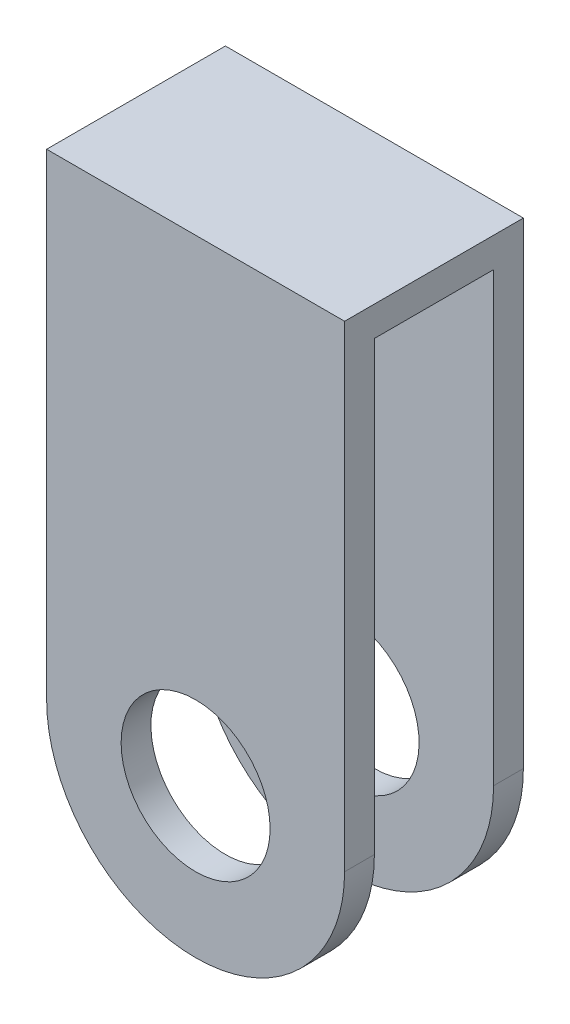
ISO-10303-21;
HEADER;
FILE_DESCRIPTION(('STEP AP214'),'2;1');
FILE_NAME('part.step','',(''),(''),'','','');
FILE_SCHEMA(('AUTOMOTIVE_DESIGN { 1 0 10303 214 1 1 1 1 }'));
ENDSEC;
DATA;
#1=APPLICATION_CONTEXT('core data for automotive mechanical design processes');
#2=APPLICATION_PROTOCOL_DEFINITION('international standard','automotive_design',2000,#1);
#3=PRODUCT_CONTEXT('',#1,'mechanical');
#4=PRODUCT('Part','Part','',(#3));
#5=PRODUCT_RELATED_PRODUCT_CATEGORY('part','',(#4));
#6=PRODUCT_DEFINITION_FORMATION('','',#4);
#7=PRODUCT_DEFINITION_CONTEXT('part definition',#1,'design');
#8=PRODUCT_DEFINITION('design','',#6,#7);
#9=PRODUCT_DEFINITION_SHAPE('','',#8);
#10=(LENGTH_UNIT() NAMED_UNIT(*) SI_UNIT(.MILLI.,.METRE.));
#11=(NAMED_UNIT(*) PLANE_ANGLE_UNIT() SI_UNIT($,.RADIAN.));
#12=(NAMED_UNIT(*) SI_UNIT($,.STERADIAN.) SOLID_ANGLE_UNIT());
#13=UNCERTAINTY_MEASURE_WITH_UNIT(LENGTH_MEASURE(1.E-05),#10,'distance_accuracy_value','');
#14=(GEOMETRIC_REPRESENTATION_CONTEXT(3) GLOBAL_UNCERTAINTY_ASSIGNED_CONTEXT((#13)) GLOBAL_UNIT_ASSIGNED_CONTEXT((#10,
#11,#12)) REPRESENTATION_CONTEXT('',''));
#15=CARTESIAN_POINT('',(0.,0.,0.));
#16=DIRECTION('',(0.,0.,1.));
#17=DIRECTION('',(1.,0.,0.));
#18=AXIS2_PLACEMENT_3D('',#15,#16,#17);
#19=CARTESIAN_POINT('',(7.91136290436442,12.2334894274483,12.));
#20=DIRECTION('',(0.,0.,-1.));
#21=DIRECTION('',(-1.,0.,0.));
#22=AXIS2_PLACEMENT_3D('',#19,#20,#21);
#23=CYLINDRICAL_SURFACE('',#22,10.);
#24=CARTESIAN_POINT('',(7.91136290436442,12.2334894274483,10.));
#25=DIRECTION('',(0.,0.,-1.));
#26=DIRECTION('',(0.,1.,0.));
#27=AXIS2_PLACEMENT_3D('',#24,#25,#26);
#28=CIRCLE('',#27,10.);
#29=CARTESIAN_POINT('',(17.9113629043644,12.2334894274483,10.));
#30=VERTEX_POINT('',#29);
#31=CARTESIAN_POINT('',(-2.08863709563558,12.2334894274483,10.));
#32=VERTEX_POINT('',#31);
#33=EDGE_CURVE('E123',#30,#32,#28,.T.);
#34=ORIENTED_EDGE('',*,*,#33,.F.);
#35=DIRECTION('',(0.,0.,-1.));
#36=VECTOR('',#35,1.);
#37=CARTESIAN_POINT('',(17.9113629043644,12.2334894274483,12.));
#38=LINE('',#37,#36);
#39=CARTESIAN_POINT('',(17.9113629043644,12.2334894274483,12.));
#40=VERTEX_POINT('',#39);
#41=EDGE_CURVE('E11',#40,#30,#38,.T.);
#42=ORIENTED_EDGE('',*,*,#41,.F.);
#43=CARTESIAN_POINT('',(7.91136290436442,12.2334894274483,12.));
#44=DIRECTION('',(0.,0.,1.));
#45=DIRECTION('',(1.,0.,0.));
#46=AXIS2_PLACEMENT_3D('',#43,#44,#45);
#47=CIRCLE('',#46,10.);
#48=CARTESIAN_POINT('',(-2.08863709563558,12.2334894274483,12.));
#49=VERTEX_POINT('',#48);
#50=EDGE_CURVE('E149',#49,#40,#47,.T.);
#51=ORIENTED_EDGE('',*,*,#50,.F.);
#52=DIRECTION('',(0.,0.,-1.));
#53=VECTOR('',#52,1.);
#54=CARTESIAN_POINT('',(-2.08863709563558,12.2334894274483,12.));
#55=LINE('',#54,#53);
#56=EDGE_CURVE('E162',#49,#32,#55,.T.);
#57=ORIENTED_EDGE('',*,*,#56,.T.);
#58=EDGE_LOOP('',(#34,#42,#51,#57));
#59=FACE_BOUND('',#58,.T.);
#60=ADVANCED_FACE('F33',(#59),#23,.T.);
#61=CARTESIAN_POINT('',(17.9113629043644,44.2334894274483,12.));
#62=DIRECTION('',(-1.,0.,0.));
#63=DIRECTION('',(0.,-1.,0.));
#64=AXIS2_PLACEMENT_3D('',#61,#62,#63);
#65=PLANE('',#64);
#66=DIRECTION('',(0.,1.,0.));
#67=VECTOR('',#66,1.);
#68=CARTESIAN_POINT('',(17.9113629043644,42.2334894274483,10.));
#69=LINE('',#68,#67);
#70=CARTESIAN_POINT('',(17.9113629043644,42.2334894274483,10.));
#71=VERTEX_POINT('',#70);
#72=EDGE_CURVE('E116',#30,#71,#69,.T.);
#73=ORIENTED_EDGE('',*,*,#72,.T.);
#74=DIRECTION('',(0.,0.,-1.));
#75=VECTOR('',#74,1.);
#76=CARTESIAN_POINT('',(17.9113629043644,42.2334894274483,2.));
#77=LINE('',#76,#75);
#78=CARTESIAN_POINT('',(17.9113629043644,42.2334894274483,2.));
#79=VERTEX_POINT('',#78);
#80=EDGE_CURVE('E113',#71,#79,#77,.T.);
#81=ORIENTED_EDGE('',*,*,#80,.T.);
#82=DIRECTION('',(0.,1.,0.));
#83=VECTOR('',#82,1.);
#84=CARTESIAN_POINT('',(17.9113629043644,42.2334894274483,2.));
#85=LINE('',#84,#83);
#86=CARTESIAN_POINT('',(17.9113629043644,12.2334894274483,2.00000000000001));
#87=VERTEX_POINT('',#86);
#88=EDGE_CURVE('E136',#87,#79,#85,.T.);
#89=ORIENTED_EDGE('',*,*,#88,.F.);
#90=CARTESIAN_POINT('',(17.9113629043644,12.2334894274483,0.));
#91=VERTEX_POINT('',#90);
#92=EDGE_CURVE('E42',#87,#91,#38,.T.);
#93=ORIENTED_EDGE('',*,*,#92,.T.);
#94=DIRECTION('',(0.,1.,0.));
#95=VECTOR('',#94,1.);
#96=CARTESIAN_POINT('',(17.9113629043644,44.2334894274483,0.));
#97=LINE('',#96,#95);
#98=CARTESIAN_POINT('',(17.9113629043644,44.2334894274483,0.));
#99=VERTEX_POINT('',#98);
#100=EDGE_CURVE('E157',#91,#99,#97,.T.);
#101=ORIENTED_EDGE('',*,*,#100,.T.);
#102=DIRECTION('',(0.,0.,-1.));
#103=VECTOR('',#102,1.);
#104=CARTESIAN_POINT('',(17.9113629043644,44.2334894274483,12.));
#105=LINE('',#104,#103);
#106=CARTESIAN_POINT('',(17.9113629043644,44.2334894274483,12.));
#107=VERTEX_POINT('',#106);
#108=EDGE_CURVE('E167',#107,#99,#105,.T.);
#109=ORIENTED_EDGE('',*,*,#108,.F.);
#110=DIRECTION('',(0.,1.,0.));
#111=VECTOR('',#110,1.);
#112=CARTESIAN_POINT('',(17.9113629043644,44.2334894274483,12.));
#113=LINE('',#112,#111);
#114=EDGE_CURVE('E88',#40,#107,#113,.T.);
#115=ORIENTED_EDGE('',*,*,#114,.F.);
#116=ORIENTED_EDGE('',*,*,#41,.T.);
#117=EDGE_LOOP('',(#73,#81,#89,#93,#101,#109,#115,#116));
#118=FACE_BOUND('',#117,.T.);
#119=ADVANCED_FACE('F196',(#118),#65,.F.);
#120=CARTESIAN_POINT('',(-2.08863709563558,12.2334894274483,12.));
#121=DIRECTION('',(1.,0.,0.));
#122=DIRECTION('',(0.,0.,-1.));
#123=AXIS2_PLACEMENT_3D('',#120,#121,#122);
#124=PLANE('',#123);
#125=DIRECTION('',(0.,-1.,0.));
#126=VECTOR('',#125,1.);
#127=CARTESIAN_POINT('',(-2.08863709563558,42.2334894274483,10.));
#128=LINE('',#127,#126);
#129=CARTESIAN_POINT('',(-2.08863709563558,42.2334894274483,10.));
#130=VERTEX_POINT('',#129);
#131=EDGE_CURVE('E120',#130,#32,#128,.T.);
#132=ORIENTED_EDGE('',*,*,#131,.T.);
#133=ORIENTED_EDGE('',*,*,#56,.F.);
#134=DIRECTION('',(0.,-1.,0.));
#135=VECTOR('',#134,1.);
#136=CARTESIAN_POINT('',(-2.08863709563558,12.2334894274483,12.));
#137=LINE('',#136,#135);
#138=CARTESIAN_POINT('',(-2.08863709563558,44.2334894274483,12.));
#139=VERTEX_POINT('',#138);
#140=EDGE_CURVE('E59',#139,#49,#137,.T.);
#141=ORIENTED_EDGE('',*,*,#140,.F.);
#142=DIRECTION('',(0.,0.,-1.));
#143=VECTOR('',#142,1.);
#144=CARTESIAN_POINT('',(-2.08863709563558,44.2334894274483,12.));
#145=LINE('',#144,#143);
#146=CARTESIAN_POINT('',(-2.08863709563558,44.2334894274483,0.));
#147=VERTEX_POINT('',#146);
#148=EDGE_CURVE('E164',#139,#147,#145,.T.);
#149=ORIENTED_EDGE('',*,*,#148,.T.);
#150=DIRECTION('',(0.,-1.,0.));
#151=VECTOR('',#150,1.);
#152=CARTESIAN_POINT('',(-2.08863709563558,12.2334894274483,0.));
#153=LINE('',#152,#151);
#154=CARTESIAN_POINT('',(-2.08863709563558,12.2334894274483,0.));
#155=VERTEX_POINT('',#154);
#156=EDGE_CURVE('E151',#147,#155,#153,.T.);
#157=ORIENTED_EDGE('',*,*,#156,.T.);
#158=CARTESIAN_POINT('',(-2.08863709563558,12.2334894274483,2.00000000000001));
#159=VERTEX_POINT('',#158);
#160=EDGE_CURVE('E81',#159,#155,#55,.T.);
#161=ORIENTED_EDGE('',*,*,#160,.F.);
#162=DIRECTION('',(0.,-1.,0.));
#163=VECTOR('',#162,1.);
#164=CARTESIAN_POINT('',(-2.08863709563558,42.2334894274483,2.));
#165=LINE('',#164,#163);
#166=CARTESIAN_POINT('',(-2.08863709563558,42.2334894274483,2.));
#167=VERTEX_POINT('',#166);
#168=EDGE_CURVE('E126',#167,#159,#165,.T.);
#169=ORIENTED_EDGE('',*,*,#168,.F.);
#170=DIRECTION('',(0.,0.,1.));
#171=VECTOR('',#170,1.);
#172=CARTESIAN_POINT('',(-2.08863709563558,42.2334894274483,2.));
#173=LINE('',#172,#171);
#174=EDGE_CURVE('E50',#167,#130,#173,.T.);
#175=ORIENTED_EDGE('',*,*,#174,.T.);
#176=EDGE_LOOP('',(#132,#133,#141,#149,#157,#161,#169,#175));
#177=FACE_BOUND('',#176,.T.);
#178=ADVANCED_FACE('F129',(#177),#124,.F.);
#179=CARTESIAN_POINT('',(7.91136290436442,12.2334894274483,12.));
#180=DIRECTION('',(0.,0.,-1.));
#181=DIRECTION('',(-1.,0.,0.));
#182=AXIS2_PLACEMENT_3D('',#179,#180,#181);
#183=CYLINDRICAL_SURFACE('',#182,5.);
#184=CARTESIAN_POINT('',(7.91136290436442,12.2334894274483,12.));
#185=DIRECTION('',(0.,0.,1.));
#186=DIRECTION('',(1.,0.,0.));
#187=AXIS2_PLACEMENT_3D('',#184,#185,#186);
#188=CIRCLE('',#187,5.);
#189=CARTESIAN_POINT('',(12.9113629043644,12.2334894274483,12.));
#190=VERTEX_POINT('',#189);
#191=EDGE_CURVE('E143',#190,#190,#188,.T.);
#192=ORIENTED_EDGE('',*,*,#191,.T.);
#193=EDGE_LOOP('',(#192));
#194=FACE_BOUND('',#193,.T.);
#195=CARTESIAN_POINT('',(7.91136290436442,12.2334894274483,10.));
#196=DIRECTION('',(0.,0.,-1.));
#197=DIRECTION('',(0.,1.,0.));
#198=AXIS2_PLACEMENT_3D('',#195,#196,#197);
#199=CIRCLE('',#198,5.);
#200=CARTESIAN_POINT('',(7.91136290436442,17.2334894274483,10.));
#201=VERTEX_POINT('',#200);
#202=EDGE_CURVE('E37',#201,#201,#199,.T.);
#203=ORIENTED_EDGE('',*,*,#202,.T.);
#204=EDGE_LOOP('',(#203));
#205=FACE_BOUND('',#204,.T.);
#206=ADVANCED_FACE('F180',(#194,#205),#183,.F.);
#207=CARTESIAN_POINT('',(7.91136290436442,12.2334894274483,12.));
#208=DIRECTION('',(0.,0.,1.));
#209=DIRECTION('',(1.,0.,0.));
#210=AXIS2_PLACEMENT_3D('',#207,#208,#209);
#211=PLANE('',#210);
#212=ORIENTED_EDGE('',*,*,#50,.T.);
#213=ORIENTED_EDGE('',*,*,#114,.T.);
#214=DIRECTION('',(-1.,0.,0.));
#215=VECTOR('',#214,1.);
#216=CARTESIAN_POINT('',(-2.08863709563558,44.2334894274483,12.));
#217=LINE('',#216,#215);
#218=EDGE_CURVE('E153',#107,#139,#217,.T.);
#219=ORIENTED_EDGE('',*,*,#218,.T.);
#220=ORIENTED_EDGE('',*,*,#140,.T.);
#221=EDGE_LOOP('',(#212,#213,#219,#220));
#222=FACE_BOUND('',#221,.T.);
#223=ORIENTED_EDGE('',*,*,#191,.F.);
#224=EDGE_LOOP('',(#223));
#225=FACE_BOUND('',#224,.T.);
#226=ADVANCED_FACE('F185',(#222,#225),#211,.T.);
#227=CARTESIAN_POINT('',(7.91136290436442,12.2334894274483,0.));
#228=DIRECTION('',(0.,0.,1.));
#229=DIRECTION('',(1.,0.,0.));
#230=AXIS2_PLACEMENT_3D('',#227,#228,#229);
#231=PLANE('',#230);
#232=CARTESIAN_POINT('',(7.91136290436442,12.2334894274483,0.));
#233=DIRECTION('',(0.,0.,1.));
#234=DIRECTION('',(1.,0.,0.));
#235=AXIS2_PLACEMENT_3D('',#232,#233,#234);
#236=CIRCLE('',#235,10.);
#237=EDGE_CURVE('E146',#155,#91,#236,.T.);
#238=ORIENTED_EDGE('',*,*,#237,.F.);
#239=ORIENTED_EDGE('',*,*,#156,.F.);
#240=DIRECTION('',(-1.,0.,0.));
#241=VECTOR('',#240,1.);
#242=CARTESIAN_POINT('',(-2.08863709563558,44.2334894274483,0.));
#243=LINE('',#242,#241);
#244=EDGE_CURVE('E159',#99,#147,#243,.T.);
#245=ORIENTED_EDGE('',*,*,#244,.F.);
#246=ORIENTED_EDGE('',*,*,#100,.F.);
#247=EDGE_LOOP('',(#238,#239,#245,#246));
#248=FACE_BOUND('',#247,.T.);
#249=CARTESIAN_POINT('',(7.91136290436442,12.2334894274483,0.));
#250=DIRECTION('',(0.,0.,1.));
#251=DIRECTION('',(1.,0.,0.));
#252=AXIS2_PLACEMENT_3D('',#249,#250,#251);
#253=CIRCLE('',#252,5.);
#254=CARTESIAN_POINT('',(12.9113629043644,12.2334894274483,0.));
#255=VERTEX_POINT('',#254);
#256=EDGE_CURVE('E142',#255,#255,#253,.T.);
#257=ORIENTED_EDGE('',*,*,#256,.T.);
#258=EDGE_LOOP('',(#257));
#259=FACE_BOUND('',#258,.T.);
#260=ADVANCED_FACE('F183',(#248,#259),#231,.F.);
#261=ORIENTED_EDGE('',*,*,#92,.F.);
#262=CARTESIAN_POINT('',(7.91136290436442,12.2334894274483,2.00000000000001));
#263=DIRECTION('',(0.,0.,-1.));
#264=DIRECTION('',(0.,1.,0.));
#265=AXIS2_PLACEMENT_3D('',#262,#263,#264);
#266=CIRCLE('',#265,10.);
#267=EDGE_CURVE('E139',#87,#159,#266,.T.);
#268=ORIENTED_EDGE('',*,*,#267,.T.);
#269=ORIENTED_EDGE('',*,*,#160,.T.);
#270=ORIENTED_EDGE('',*,*,#237,.T.);
#271=EDGE_LOOP('',(#261,#268,#269,#270));
#272=FACE_BOUND('',#271,.T.);
#273=ADVANCED_FACE('F35',(#272),#23,.T.);
#274=CARTESIAN_POINT('',(-2.08863709563558,44.2334894274483,12.));
#275=DIRECTION('',(0.,-1.,0.));
#276=DIRECTION('',(1.,0.,0.));
#277=AXIS2_PLACEMENT_3D('',#274,#275,#276);
#278=PLANE('',#277);
#279=ORIENTED_EDGE('',*,*,#244,.T.);
#280=ORIENTED_EDGE('',*,*,#148,.F.);
#281=ORIENTED_EDGE('',*,*,#218,.F.);
#282=ORIENTED_EDGE('',*,*,#108,.T.);
#283=EDGE_LOOP('',(#279,#280,#281,#282));
#284=FACE_BOUND('',#283,.T.);
#285=ADVANCED_FACE('F178',(#284),#278,.F.);
#286=CARTESIAN_POINT('',(7.91136290436442,12.2334894274483,2.00000000000001));
#287=DIRECTION('',(0.,0.,-1.));
#288=DIRECTION('',(0.,1.,0.));
#289=AXIS2_PLACEMENT_3D('',#286,#287,#288);
#290=CIRCLE('',#289,5.);
#291=CARTESIAN_POINT('',(7.91136290436442,17.2334894274483,2.00000000000001));
#292=VERTEX_POINT('',#291);
#293=EDGE_CURVE('E138',#292,#292,#290,.T.);
#294=ORIENTED_EDGE('',*,*,#293,.F.);
#295=EDGE_LOOP('',(#294));
#296=FACE_BOUND('',#295,.T.);
#297=ORIENTED_EDGE('',*,*,#256,.F.);
#298=EDGE_LOOP('',(#297));
#299=FACE_BOUND('',#298,.T.);
#300=ADVANCED_FACE('F175',(#296,#299),#183,.F.);
#301=CARTESIAN_POINT('',(60.8958674288834,42.2334894274483,10.));
#302=DIRECTION('',(0.,0.,-1.));
#303=DIRECTION('',(0.,1.,0.));
#304=AXIS2_PLACEMENT_3D('',#301,#302,#303);
#305=PLANE('',#304);
#306=ORIENTED_EDGE('',*,*,#202,.F.);
#307=EDGE_LOOP('',(#306));
#308=FACE_BOUND('',#307,.T.);
#309=ORIENTED_EDGE('',*,*,#33,.T.);
#310=ORIENTED_EDGE('',*,*,#131,.F.);
#311=DIRECTION('',(-1.,0.,0.));
#312=VECTOR('',#311,1.);
#313=CARTESIAN_POINT('',(60.8958674288834,42.2334894274483,10.));
#314=LINE('',#313,#312);
#315=EDGE_CURVE('E109',#71,#130,#314,.T.);
#316=ORIENTED_EDGE('',*,*,#315,.F.);
#317=ORIENTED_EDGE('',*,*,#72,.F.);
#318=EDGE_LOOP('',(#309,#310,#316,#317));
#319=FACE_BOUND('',#318,.T.);
#320=ADVANCED_FACE('F121',(#308,#319),#305,.T.);
#321=CARTESIAN_POINT('',(60.8958674288834,42.2334894274483,2.));
#322=DIRECTION('',(0.,0.,-1.));
#323=DIRECTION('',(0.,1.,0.));
#324=AXIS2_PLACEMENT_3D('',#321,#322,#323);
#325=PLANE('',#324);
#326=ORIENTED_EDGE('',*,*,#293,.T.);
#327=EDGE_LOOP('',(#326));
#328=FACE_BOUND('',#327,.T.);
#329=ORIENTED_EDGE('',*,*,#88,.T.);
#330=DIRECTION('',(-1.,0.,0.));
#331=VECTOR('',#330,1.);
#332=CARTESIAN_POINT('',(60.8958674288834,42.2334894274483,2.));
#333=LINE('',#332,#331);
#334=EDGE_CURVE('E117',#79,#167,#333,.T.);
#335=ORIENTED_EDGE('',*,*,#334,.T.);
#336=ORIENTED_EDGE('',*,*,#168,.T.);
#337=ORIENTED_EDGE('',*,*,#267,.F.);
#338=EDGE_LOOP('',(#329,#335,#336,#337));
#339=FACE_BOUND('',#338,.T.);
#340=ADVANCED_FACE('F172',(#328,#339),#325,.F.);
#341=CARTESIAN_POINT('',(60.8958674288834,42.2334894274483,2.));
#342=DIRECTION('',(0.,-1.,0.));
#343=DIRECTION('',(0.,0.,-1.));
#344=AXIS2_PLACEMENT_3D('',#341,#342,#343);
#345=PLANE('',#344);
#346=ORIENTED_EDGE('',*,*,#315,.T.);
#347=ORIENTED_EDGE('',*,*,#174,.F.);
#348=ORIENTED_EDGE('',*,*,#334,.F.);
#349=ORIENTED_EDGE('',*,*,#80,.F.);
#350=EDGE_LOOP('',(#346,#347,#348,#349));
#351=FACE_BOUND('',#350,.T.);
#352=ADVANCED_FACE('F111',(#351),#345,.T.);
#353=CLOSED_SHELL('',(#60,#119,#178,#206,#226,#260,#273,#285,#300,#320,#340,#352));
#354=MANIFOLD_SOLID_BREP('B2',#353);
#355=ADVANCED_BREP_SHAPE_REPRESENTATION('',(#18,#354),#14);
#356=SHAPE_DEFINITION_REPRESENTATION(#9,#355);
ENDSEC;
END-ISO-10303-21;
